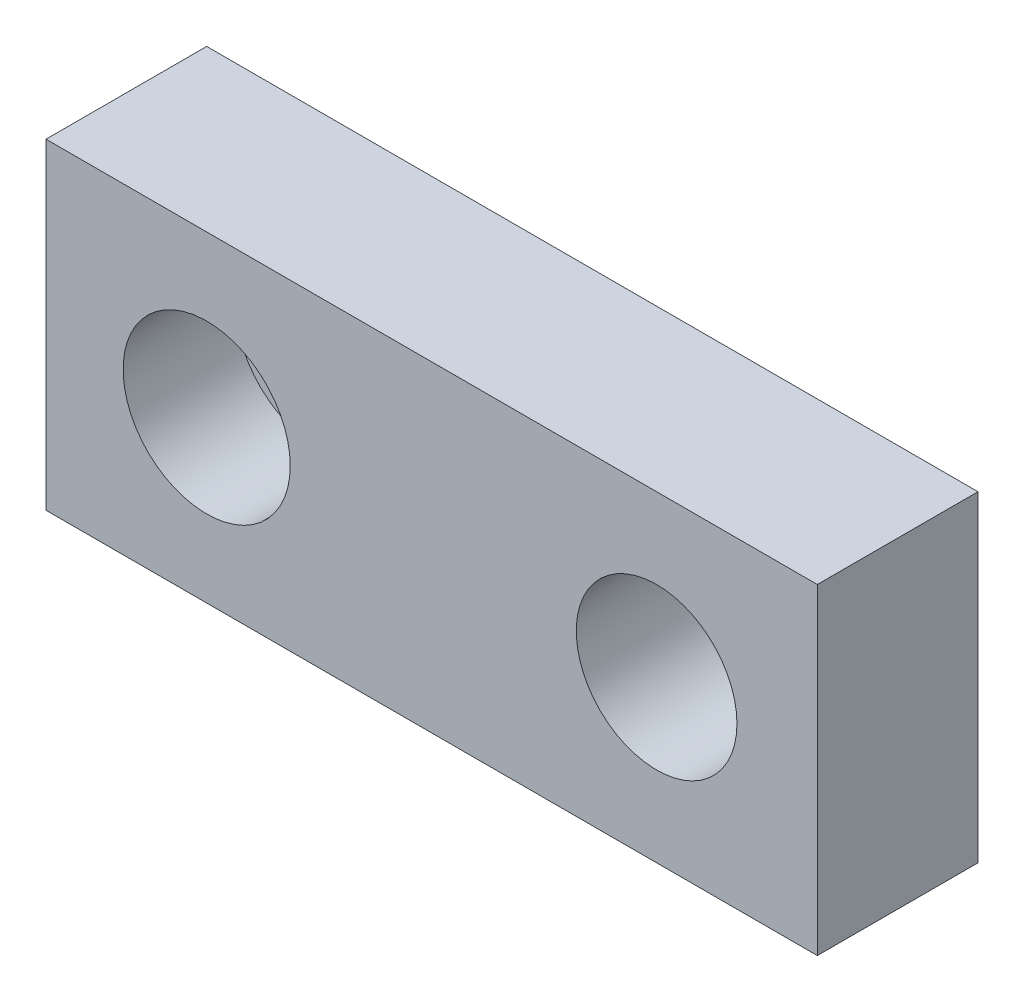
ISO-10303-21;
HEADER;
FILE_DESCRIPTION(('STEP AP214'),'2;1');
FILE_NAME('part.step','',(''),(''),'','','');
FILE_SCHEMA(('AUTOMOTIVE_DESIGN { 1 0 10303 214 1 1 1 1 }'));
ENDSEC;
DATA;
#1=APPLICATION_CONTEXT('core data for automotive mechanical design processes');
#2=APPLICATION_PROTOCOL_DEFINITION('international standard','automotive_design',2000,#1);
#3=PRODUCT_CONTEXT('',#1,'mechanical');
#4=PRODUCT('Part','Part','',(#3));
#5=PRODUCT_RELATED_PRODUCT_CATEGORY('part','',(#4));
#6=PRODUCT_DEFINITION_FORMATION('','',#4);
#7=PRODUCT_DEFINITION_CONTEXT('part definition',#1,'design');
#8=PRODUCT_DEFINITION('design','',#6,#7);
#9=PRODUCT_DEFINITION_SHAPE('','',#8);
#10=(LENGTH_UNIT() NAMED_UNIT(*) SI_UNIT(.MILLI.,.METRE.));
#11=(NAMED_UNIT(*) PLANE_ANGLE_UNIT() SI_UNIT($,.RADIAN.));
#12=(NAMED_UNIT(*) SI_UNIT($,.STERADIAN.) SOLID_ANGLE_UNIT());
#13=UNCERTAINTY_MEASURE_WITH_UNIT(LENGTH_MEASURE(1.E-05),#10,'distance_accuracy_value','');
#14=(GEOMETRIC_REPRESENTATION_CONTEXT(3) GLOBAL_UNCERTAINTY_ASSIGNED_CONTEXT((#13)) GLOBAL_UNIT_ASSIGNED_CONTEXT((#10,
#11,#12)) REPRESENTATION_CONTEXT('',''));
#15=CARTESIAN_POINT('',(0.,0.,0.));
#16=DIRECTION('',(0.,0.,1.));
#17=DIRECTION('',(1.,0.,0.));
#18=AXIS2_PLACEMENT_3D('',#15,#16,#17);
#19=CARTESIAN_POINT('',(60.,-25.,25.));
#20=DIRECTION('',(-1.,0.,0.));
#21=DIRECTION('',(0.,0.,1.));
#22=AXIS2_PLACEMENT_3D('',#19,#20,#21);
#23=PLANE('',#22);
#24=DIRECTION('',(0.,1.,0.));
#25=VECTOR('',#24,1.);
#26=CARTESIAN_POINT('',(60.,-25.,0.));
#27=LINE('',#26,#25);
#28=CARTESIAN_POINT('',(60.,-25.,0.));
#29=VERTEX_POINT('',#28);
#30=CARTESIAN_POINT('',(60.,25.,0.));
#31=VERTEX_POINT('',#30);
#32=EDGE_CURVE('E80',#29,#31,#27,.T.);
#33=ORIENTED_EDGE('',*,*,#32,.T.);
#34=DIRECTION('',(0.,0.,-1.));
#35=VECTOR('',#34,1.);
#36=CARTESIAN_POINT('',(60.,25.,25.));
#37=LINE('',#36,#35);
#38=CARTESIAN_POINT('',(60.,25.,25.));
#39=VERTEX_POINT('',#38);
#40=EDGE_CURVE('E11',#39,#31,#37,.T.);
#41=ORIENTED_EDGE('',*,*,#40,.F.);
#42=DIRECTION('',(0.,1.,0.));
#43=VECTOR('',#42,1.);
#44=CARTESIAN_POINT('',(60.,-25.,25.));
#45=LINE('',#44,#43);
#46=CARTESIAN_POINT('',(60.,-25.,25.));
#47=VERTEX_POINT('',#46);
#48=EDGE_CURVE('E68',#47,#39,#45,.T.);
#49=ORIENTED_EDGE('',*,*,#48,.F.);
#50=DIRECTION('',(0.,0.,-1.));
#51=VECTOR('',#50,1.);
#52=CARTESIAN_POINT('',(60.,-25.,25.));
#53=LINE('',#52,#51);
#54=EDGE_CURVE('E76',#47,#29,#53,.T.);
#55=ORIENTED_EDGE('',*,*,#54,.T.);
#56=EDGE_LOOP('',(#33,#41,#49,#55));
#57=FACE_BOUND('',#56,.T.);
#58=ADVANCED_FACE('F17',(#57),#23,.F.);
#59=CARTESIAN_POINT('',(-60.,25.,25.));
#60=DIRECTION('',(0.,-1.,0.));
#61=DIRECTION('',(0.,0.,-1.));
#62=AXIS2_PLACEMENT_3D('',#59,#60,#61);
#63=PLANE('',#62);
#64=DIRECTION('',(-1.,0.,0.));
#65=VECTOR('',#64,1.);
#66=CARTESIAN_POINT('',(-60.,25.,0.));
#67=LINE('',#66,#65);
#68=CARTESIAN_POINT('',(-60.,25.,0.));
#69=VERTEX_POINT('',#68);
#70=EDGE_CURVE('E72',#31,#69,#67,.T.);
#71=ORIENTED_EDGE('',*,*,#70,.T.);
#72=DIRECTION('',(0.,0.,-1.));
#73=VECTOR('',#72,1.);
#74=CARTESIAN_POINT('',(-60.,25.,25.));
#75=LINE('',#74,#73);
#76=CARTESIAN_POINT('',(-60.,25.,25.));
#77=VERTEX_POINT('',#76);
#78=EDGE_CURVE('E25',#77,#69,#75,.T.);
#79=ORIENTED_EDGE('',*,*,#78,.F.);
#80=DIRECTION('',(-1.,0.,0.));
#81=VECTOR('',#80,1.);
#82=CARTESIAN_POINT('',(-60.,25.,25.));
#83=LINE('',#82,#81);
#84=EDGE_CURVE('E63',#39,#77,#83,.T.);
#85=ORIENTED_EDGE('',*,*,#84,.F.);
#86=ORIENTED_EDGE('',*,*,#40,.T.);
#87=EDGE_LOOP('',(#71,#79,#85,#86));
#88=FACE_BOUND('',#87,.T.);
#89=ADVANCED_FACE('F71',(#88),#63,.F.);
#90=CARTESIAN_POINT('',(-60.,-25.,25.));
#91=DIRECTION('',(1.,0.,0.));
#92=DIRECTION('',(0.,0.,-1.));
#93=AXIS2_PLACEMENT_3D('',#90,#91,#92);
#94=PLANE('',#93);
#95=DIRECTION('',(0.,-1.,0.));
#96=VECTOR('',#95,1.);
#97=CARTESIAN_POINT('',(-60.,-25.,0.));
#98=LINE('',#97,#96);
#99=CARTESIAN_POINT('',(-60.,-25.,0.));
#100=VERTEX_POINT('',#99);
#101=EDGE_CURVE('E50',#69,#100,#98,.T.);
#102=ORIENTED_EDGE('',*,*,#101,.T.);
#103=DIRECTION('',(0.,0.,-1.));
#104=VECTOR('',#103,1.);
#105=CARTESIAN_POINT('',(-60.,-25.,25.));
#106=LINE('',#105,#104);
#107=CARTESIAN_POINT('',(-60.,-25.,25.));
#108=VERTEX_POINT('',#107);
#109=EDGE_CURVE('E73',#108,#100,#106,.T.);
#110=ORIENTED_EDGE('',*,*,#109,.F.);
#111=DIRECTION('',(0.,-1.,0.));
#112=VECTOR('',#111,1.);
#113=CARTESIAN_POINT('',(-60.,-25.,25.));
#114=LINE('',#113,#112);
#115=EDGE_CURVE('E66',#77,#108,#114,.T.);
#116=ORIENTED_EDGE('',*,*,#115,.F.);
#117=ORIENTED_EDGE('',*,*,#78,.T.);
#118=EDGE_LOOP('',(#102,#110,#116,#117));
#119=FACE_BOUND('',#118,.T.);
#120=ADVANCED_FACE('F74',(#119),#94,.F.);
#121=CARTESIAN_POINT('',(-60.,-25.,25.));
#122=DIRECTION('',(0.,1.,0.));
#123=DIRECTION('',(0.,0.,1.));
#124=AXIS2_PLACEMENT_3D('',#121,#122,#123);
#125=PLANE('',#124);
#126=DIRECTION('',(1.,0.,0.));
#127=VECTOR('',#126,1.);
#128=CARTESIAN_POINT('',(-60.,-25.,0.));
#129=LINE('',#128,#127);
#130=EDGE_CURVE('E56',#100,#29,#129,.T.);
#131=ORIENTED_EDGE('',*,*,#130,.T.);
#132=ORIENTED_EDGE('',*,*,#54,.F.);
#133=DIRECTION('',(1.,0.,0.));
#134=VECTOR('',#133,1.);
#135=CARTESIAN_POINT('',(-60.,-25.,25.));
#136=LINE('',#135,#134);
#137=EDGE_CURVE('E33',#108,#47,#136,.T.);
#138=ORIENTED_EDGE('',*,*,#137,.F.);
#139=ORIENTED_EDGE('',*,*,#109,.T.);
#140=EDGE_LOOP('',(#131,#132,#138,#139));
#141=FACE_BOUND('',#140,.T.);
#142=ADVANCED_FACE('F88',(#141),#125,.F.);
#143=CARTESIAN_POINT('',(0.,0.,25.));
#144=DIRECTION('',(0.,0.,-1.));
#145=DIRECTION('',(-1.,0.,0.));
#146=AXIS2_PLACEMENT_3D('',#143,#144,#145);
#147=PLANE('',#146);
#148=CARTESIAN_POINT('',(35.,0.,25.));
#149=DIRECTION('',(0.,0.,1.));
#150=DIRECTION('',(1.,0.,0.));
#151=AXIS2_PLACEMENT_3D('',#148,#149,#150);
#152=CIRCLE('',#151,12.5);
#153=CARTESIAN_POINT('',(47.5,0.,25.));
#154=VERTEX_POINT('',#153);
#155=EDGE_CURVE('E108',#154,#154,#152,.T.);
#156=ORIENTED_EDGE('',*,*,#155,.F.);
#157=EDGE_LOOP('',(#156));
#158=FACE_BOUND('',#157,.T.);
#159=CARTESIAN_POINT('',(-35.,0.,25.));
#160=DIRECTION('',(0.,0.,1.));
#161=DIRECTION('',(1.,0.,0.));
#162=AXIS2_PLACEMENT_3D('',#159,#160,#161);
#163=CIRCLE('',#162,13.);
#164=CARTESIAN_POINT('',(-22.,0.,25.));
#165=VERTEX_POINT('',#164);
#166=EDGE_CURVE('E102',#165,#165,#163,.T.);
#167=ORIENTED_EDGE('',*,*,#166,.F.);
#168=EDGE_LOOP('',(#167));
#169=FACE_BOUND('',#168,.T.);
#170=ORIENTED_EDGE('',*,*,#48,.T.);
#171=ORIENTED_EDGE('',*,*,#84,.T.);
#172=ORIENTED_EDGE('',*,*,#115,.T.);
#173=ORIENTED_EDGE('',*,*,#137,.T.);
#174=EDGE_LOOP('',(#170,#171,#172,#173));
#175=FACE_BOUND('',#174,.T.);
#176=ADVANCED_FACE('F64',(#158,#169,#175),#147,.F.);
#177=CARTESIAN_POINT('',(0.,0.,0.));
#178=DIRECTION('',(0.,0.,-1.));
#179=DIRECTION('',(-1.,0.,0.));
#180=AXIS2_PLACEMENT_3D('',#177,#178,#179);
#181=PLANE('',#180);
#182=CARTESIAN_POINT('',(35.,0.,0.));
#183=DIRECTION('',(0.,0.,1.));
#184=DIRECTION('',(1.,0.,0.));
#185=AXIS2_PLACEMENT_3D('',#182,#183,#184);
#186=CIRCLE('',#185,12.5);
#187=CARTESIAN_POINT('',(47.5,0.,0.));
#188=VERTEX_POINT('',#187);
#189=EDGE_CURVE('E105',#188,#188,#186,.T.);
#190=ORIENTED_EDGE('',*,*,#189,.T.);
#191=EDGE_LOOP('',(#190));
#192=FACE_BOUND('',#191,.T.);
#193=CARTESIAN_POINT('',(-35.,0.,0.));
#194=DIRECTION('',(0.,0.,1.));
#195=DIRECTION('',(1.,0.,0.));
#196=AXIS2_PLACEMENT_3D('',#193,#194,#195);
#197=CIRCLE('',#196,9.5);
#198=CARTESIAN_POINT('',(-25.5,0.,0.));
#199=VERTEX_POINT('',#198);
#200=EDGE_CURVE('E83',#199,#199,#197,.T.);
#201=ORIENTED_EDGE('',*,*,#200,.T.);
#202=EDGE_LOOP('',(#201));
#203=FACE_BOUND('',#202,.T.);
#204=ORIENTED_EDGE('',*,*,#32,.F.);
#205=ORIENTED_EDGE('',*,*,#130,.F.);
#206=ORIENTED_EDGE('',*,*,#101,.F.);
#207=ORIENTED_EDGE('',*,*,#70,.F.);
#208=EDGE_LOOP('',(#204,#205,#206,#207));
#209=FACE_BOUND('',#208,.T.);
#210=ADVANCED_FACE('F91',(#192,#203,#209),#181,.T.);
#211=CARTESIAN_POINT('',(-35.,0.,25.));
#212=DIRECTION('',(0.,0.,1.));
#213=DIRECTION('',(1.,0.,0.));
#214=AXIS2_PLACEMENT_3D('',#211,#212,#213);
#215=CYLINDRICAL_SURFACE('',#214,9.5);
#216=ORIENTED_EDGE('',*,*,#200,.F.);
#217=EDGE_LOOP('',(#216));
#218=FACE_BOUND('',#217,.T.);
#219=CARTESIAN_POINT('',(-35.,0.,7.5));
#220=DIRECTION('',(0.,0.,1.));
#221=DIRECTION('',(1.,0.,0.));
#222=AXIS2_PLACEMENT_3D('',#219,#220,#221);
#223=CIRCLE('',#222,9.5);
#224=CARTESIAN_POINT('',(-25.5,0.,7.5));
#225=VERTEX_POINT('',#224);
#226=EDGE_CURVE('E96',#225,#225,#223,.T.);
#227=ORIENTED_EDGE('',*,*,#226,.T.);
#228=EDGE_LOOP('',(#227));
#229=FACE_BOUND('',#228,.T.);
#230=ADVANCED_FACE('F131',(#218,#229),#215,.F.);
#231=CARTESIAN_POINT('',(-25.5,0.,7.5));
#232=DIRECTION('',(0.,0.,-1.));
#233=DIRECTION('',(-1.,0.,0.));
#234=AXIS2_PLACEMENT_3D('',#231,#232,#233);
#235=PLANE('',#234);
#236=ORIENTED_EDGE('',*,*,#226,.F.);
#237=EDGE_LOOP('',(#236));
#238=FACE_BOUND('',#237,.T.);
#239=CARTESIAN_POINT('',(-35.,0.,7.5));
#240=DIRECTION('',(0.,0.,1.));
#241=DIRECTION('',(1.,0.,0.));
#242=AXIS2_PLACEMENT_3D('',#239,#240,#241);
#243=CIRCLE('',#242,13.);
#244=CARTESIAN_POINT('',(-22.,0.,7.5));
#245=VERTEX_POINT('',#244);
#246=EDGE_CURVE('E99',#245,#245,#243,.T.);
#247=ORIENTED_EDGE('',*,*,#246,.T.);
#248=EDGE_LOOP('',(#247));
#249=FACE_BOUND('',#248,.T.);
#250=ADVANCED_FACE('F121',(#238,#249),#235,.F.);
#251=CARTESIAN_POINT('',(-35.,0.,25.));
#252=DIRECTION('',(0.,0.,1.));
#253=DIRECTION('',(1.,0.,0.));
#254=AXIS2_PLACEMENT_3D('',#251,#252,#253);
#255=CYLINDRICAL_SURFACE('',#254,13.);
#256=ORIENTED_EDGE('',*,*,#246,.F.);
#257=EDGE_LOOP('',(#256));
#258=FACE_BOUND('',#257,.T.);
#259=ORIENTED_EDGE('',*,*,#166,.T.);
#260=EDGE_LOOP('',(#259));
#261=FACE_BOUND('',#260,.T.);
#262=ADVANCED_FACE('F119',(#258,#261),#255,.F.);
#263=CARTESIAN_POINT('',(35.,0.,25.));
#264=DIRECTION('',(0.,0.,1.));
#265=DIRECTION('',(1.,0.,0.));
#266=AXIS2_PLACEMENT_3D('',#263,#264,#265);
#267=CYLINDRICAL_SURFACE('',#266,12.5);
#268=ORIENTED_EDGE('',*,*,#189,.F.);
#269=EDGE_LOOP('',(#268));
#270=FACE_BOUND('',#269,.T.);
#271=ORIENTED_EDGE('',*,*,#155,.T.);
#272=EDGE_LOOP('',(#271));
#273=FACE_BOUND('',#272,.T.);
#274=ADVANCED_FACE('F112',(#270,#273),#267,.F.);
#275=CLOSED_SHELL('',(#58,#89,#120,#142,#176,#210,#230,#250,#262,#274));
#276=MANIFOLD_SOLID_BREP('B1',#275);
#277=ADVANCED_BREP_SHAPE_REPRESENTATION('',(#18,#276),#14);
#278=SHAPE_DEFINITION_REPRESENTATION(#9,#277);
ENDSEC;
END-ISO-10303-21;
